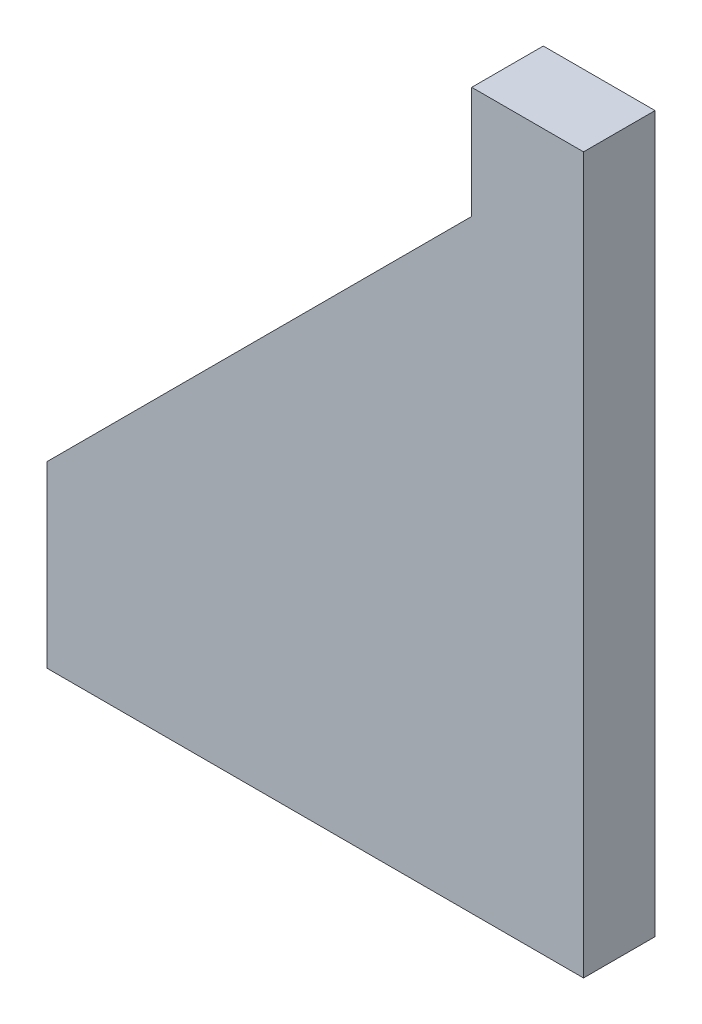
ISO-10303-21;
HEADER;
FILE_DESCRIPTION(('STEP AP214'),'2;1');
FILE_NAME('part.step','',(''),(''),'','','');
FILE_SCHEMA(('AUTOMOTIVE_DESIGN { 1 0 10303 214 1 1 1 1 }'));
ENDSEC;
DATA;
#1=APPLICATION_CONTEXT('core data for automotive mechanical design processes');
#2=APPLICATION_PROTOCOL_DEFINITION('international standard','automotive_design',2000,#1);
#3=PRODUCT_CONTEXT('',#1,'mechanical');
#4=PRODUCT('Part','Part','',(#3));
#5=PRODUCT_RELATED_PRODUCT_CATEGORY('part','',(#4));
#6=PRODUCT_DEFINITION_FORMATION('','',#4);
#7=PRODUCT_DEFINITION_CONTEXT('part definition',#1,'design');
#8=PRODUCT_DEFINITION('design','',#6,#7);
#9=PRODUCT_DEFINITION_SHAPE('','',#8);
#10=(LENGTH_UNIT() NAMED_UNIT(*) SI_UNIT(.MILLI.,.METRE.));
#11=(NAMED_UNIT(*) PLANE_ANGLE_UNIT() SI_UNIT($,.RADIAN.));
#12=(NAMED_UNIT(*) SI_UNIT($,.STERADIAN.) SOLID_ANGLE_UNIT());
#13=UNCERTAINTY_MEASURE_WITH_UNIT(LENGTH_MEASURE(1.E-05),#10,'distance_accuracy_value','');
#14=(GEOMETRIC_REPRESENTATION_CONTEXT(3) GLOBAL_UNCERTAINTY_ASSIGNED_CONTEXT((#13)) GLOBAL_UNIT_ASSIGNED_CONTEXT((#10,
#11,#12)) REPRESENTATION_CONTEXT('',''));
#15=CARTESIAN_POINT('',(0.,0.,0.));
#16=DIRECTION('',(0.,0.,1.));
#17=DIRECTION('',(1.,0.,0.));
#18=AXIS2_PLACEMENT_3D('',#15,#16,#17);
#19=CARTESIAN_POINT('',(-15.628610956945,-412.480747772816,40.));
#20=DIRECTION('',(-1.,0.,0.));
#21=DIRECTION('',(0.,0.,1.));
#22=AXIS2_PLACEMENT_3D('',#19,#20,#21);
#23=PLANE('',#22);
#24=DIRECTION('',(0.,1.,0.));
#25=VECTOR('',#24,1.);
#26=CARTESIAN_POINT('',(-15.628610956945,-412.480747772816,0.));
#27=LINE('',#26,#25);
#28=CARTESIAN_POINT('',(-15.628610956945,282.34173693086,0.));
#29=VERTEX_POINT('',#28);
#30=CARTESIAN_POINT('',(-15.628610956945,344.84173693086,0.));
#31=VERTEX_POINT('',#30);
#32=EDGE_CURVE('E112',#29,#31,#27,.T.);
#33=ORIENTED_EDGE('',*,*,#32,.F.);
#34=DIRECTION('',(0.,0.,-1.));
#35=VECTOR('',#34,1.);
#36=CARTESIAN_POINT('',(-15.628610956945,282.34173693086,40.));
#37=LINE('',#36,#35);
#38=CARTESIAN_POINT('',(-15.628610956945,282.34173693086,40.));
#39=VERTEX_POINT('',#38);
#40=EDGE_CURVE('E11',#39,#29,#37,.T.);
#41=ORIENTED_EDGE('',*,*,#40,.F.);
#42=DIRECTION('',(0.,1.,0.));
#43=VECTOR('',#42,1.);
#44=CARTESIAN_POINT('',(-15.628610956945,-412.480747772816,40.));
#45=LINE('',#44,#43);
#46=CARTESIAN_POINT('',(-15.628610956945,344.84173693086,40.));
#47=VERTEX_POINT('',#46);
#48=EDGE_CURVE('E125',#39,#47,#45,.T.);
#49=ORIENTED_EDGE('',*,*,#48,.T.);
#50=DIRECTION('',(0.,0.,-1.));
#51=VECTOR('',#50,1.);
#52=CARTESIAN_POINT('',(-15.628610956945,344.84173693086,40.));
#53=LINE('',#52,#51);
#54=EDGE_CURVE('E77',#47,#31,#53,.T.);
#55=ORIENTED_EDGE('',*,*,#54,.T.);
#56=EDGE_LOOP('',(#33,#41,#49,#55));
#57=FACE_BOUND('',#56,.T.);
#58=ADVANCED_FACE('F32',(#57),#23,.T.);
#59=CARTESIAN_POINT('',(-364.363959311361,-66.3936114235557,40.));
#60=DIRECTION('',(-0.707106781186548,0.707106781186547,0.));
#61=DIRECTION('',(-0.707106781186547,-0.707106781186548,0.));
#62=AXIS2_PLACEMENT_3D('',#59,#60,#61);
#63=PLANE('',#62);
#64=DIRECTION('',(0.707106781186547,0.707106781186548,0.));
#65=VECTOR('',#64,1.);
#66=CARTESIAN_POINT('',(-364.363959311361,-66.3936114235557,0.));
#67=LINE('',#66,#65);
#68=CARTESIAN_POINT('',(-253.128610956945,44.8417369308601,0.));
#69=VERTEX_POINT('',#68);
#70=EDGE_CURVE('E115',#69,#29,#67,.T.);
#71=ORIENTED_EDGE('',*,*,#70,.F.);
#72=DIRECTION('',(0.,0.,-1.));
#73=VECTOR('',#72,1.);
#74=CARTESIAN_POINT('',(-253.128610956945,44.8417369308601,40.));
#75=LINE('',#74,#73);
#76=CARTESIAN_POINT('',(-253.128610956945,44.8417369308601,40.));
#77=VERTEX_POINT('',#76);
#78=EDGE_CURVE('E40',#77,#69,#75,.T.);
#79=ORIENTED_EDGE('',*,*,#78,.F.);
#80=DIRECTION('',(0.707106781186547,0.707106781186548,0.));
#81=VECTOR('',#80,1.);
#82=CARTESIAN_POINT('',(-364.363959311361,-66.3936114235557,40.));
#83=LINE('',#82,#81);
#84=EDGE_CURVE('E140',#77,#39,#83,.T.);
#85=ORIENTED_EDGE('',*,*,#84,.T.);
#86=ORIENTED_EDGE('',*,*,#40,.T.);
#87=EDGE_LOOP('',(#71,#79,#85,#86));
#88=FACE_BOUND('',#87,.T.);
#89=ADVANCED_FACE('F134',(#88),#63,.T.);
#90=CARTESIAN_POINT('',(-253.128610956945,-412.480747772816,40.));
#91=DIRECTION('',(-1.,0.,0.));
#92=DIRECTION('',(0.,0.,1.));
#93=AXIS2_PLACEMENT_3D('',#90,#91,#92);
#94=PLANE('',#93);
#95=DIRECTION('',(0.,1.,0.));
#96=VECTOR('',#95,1.);
#97=CARTESIAN_POINT('',(-253.128610956945,-412.480747772816,0.));
#98=LINE('',#97,#96);
#99=CARTESIAN_POINT('',(-253.128610956945,-55.15826306914,0.));
#100=VERTEX_POINT('',#99);
#101=EDGE_CURVE('E118',#100,#69,#98,.T.);
#102=ORIENTED_EDGE('',*,*,#101,.F.);
#103=DIRECTION('',(0.,0.,-1.));
#104=VECTOR('',#103,1.);
#105=CARTESIAN_POINT('',(-253.128610956945,-55.15826306914,40.));
#106=LINE('',#105,#104);
#107=CARTESIAN_POINT('',(-253.128610956945,-55.15826306914,40.));
#108=VERTEX_POINT('',#107);
#109=EDGE_CURVE('E104',#108,#100,#106,.T.);
#110=ORIENTED_EDGE('',*,*,#109,.F.);
#111=DIRECTION('',(0.,1.,0.));
#112=VECTOR('',#111,1.);
#113=CARTESIAN_POINT('',(-253.128610956945,-412.480747772816,40.));
#114=LINE('',#113,#112);
#115=EDGE_CURVE('E97',#108,#77,#114,.T.);
#116=ORIENTED_EDGE('',*,*,#115,.T.);
#117=ORIENTED_EDGE('',*,*,#78,.T.);
#118=EDGE_LOOP('',(#102,#110,#116,#117));
#119=FACE_BOUND('',#118,.T.);
#120=ADVANCED_FACE('F131',(#119),#94,.T.);
#121=CARTESIAN_POINT('',(-18.2768229620998,-55.15826306914,40.));
#122=DIRECTION('',(0.,1.,0.));
#123=DIRECTION('',(0.,0.,1.));
#124=AXIS2_PLACEMENT_3D('',#121,#122,#123);
#125=PLANE('',#124);
#126=DIRECTION('',(1.,0.,0.));
#127=VECTOR('',#126,1.);
#128=CARTESIAN_POINT('',(-18.2768229620998,-55.15826306914,0.));
#129=LINE('',#128,#127);
#130=CARTESIAN_POINT('',(46.8713890430551,-55.15826306914,0.));
#131=VERTEX_POINT('',#130);
#132=EDGE_CURVE('E103',#100,#131,#129,.T.);
#133=ORIENTED_EDGE('',*,*,#132,.T.);
#134=DIRECTION('',(0.,0.,-1.));
#135=VECTOR('',#134,1.);
#136=CARTESIAN_POINT('',(46.8713890430551,-55.15826306914,40.));
#137=LINE('',#136,#135);
#138=CARTESIAN_POINT('',(46.8713890430551,-55.15826306914,40.));
#139=VERTEX_POINT('',#138);
#140=EDGE_CURVE('E100',#139,#131,#137,.T.);
#141=ORIENTED_EDGE('',*,*,#140,.F.);
#142=DIRECTION('',(1.,0.,0.));
#143=VECTOR('',#142,1.);
#144=CARTESIAN_POINT('',(-18.2768229620998,-55.15826306914,40.));
#145=LINE('',#144,#143);
#146=EDGE_CURVE('E90',#108,#139,#145,.T.);
#147=ORIENTED_EDGE('',*,*,#146,.F.);
#148=ORIENTED_EDGE('',*,*,#109,.T.);
#149=EDGE_LOOP('',(#133,#141,#147,#148));
#150=FACE_BOUND('',#149,.T.);
#151=ADVANCED_FACE('F101',(#150),#125,.F.);
#152=CARTESIAN_POINT('',(46.8713890430551,-412.480747772816,40.));
#153=DIRECTION('',(-1.,0.,0.));
#154=DIRECTION('',(0.,0.,1.));
#155=AXIS2_PLACEMENT_3D('',#152,#153,#154);
#156=PLANE('',#155);
#157=DIRECTION('',(0.,1.,0.));
#158=VECTOR('',#157,1.);
#159=CARTESIAN_POINT('',(46.8713890430551,-412.480747772816,0.));
#160=LINE('',#159,#158);
#161=CARTESIAN_POINT('',(46.8713890430551,344.84173693086,0.));
#162=VERTEX_POINT('',#161);
#163=EDGE_CURVE('E70',#131,#162,#160,.T.);
#164=ORIENTED_EDGE('',*,*,#163,.T.);
#165=DIRECTION('',(0.,0.,-1.));
#166=VECTOR('',#165,1.);
#167=CARTESIAN_POINT('',(46.8713890430551,344.84173693086,40.));
#168=LINE('',#167,#166);
#169=CARTESIAN_POINT('',(46.8713890430551,344.84173693086,40.));
#170=VERTEX_POINT('',#169);
#171=EDGE_CURVE('E105',#170,#162,#168,.T.);
#172=ORIENTED_EDGE('',*,*,#171,.F.);
#173=DIRECTION('',(0.,1.,0.));
#174=VECTOR('',#173,1.);
#175=CARTESIAN_POINT('',(46.8713890430551,-412.480747772816,40.));
#176=LINE('',#175,#174);
#177=EDGE_CURVE('E94',#139,#170,#176,.T.);
#178=ORIENTED_EDGE('',*,*,#177,.F.);
#179=ORIENTED_EDGE('',*,*,#140,.T.);
#180=EDGE_LOOP('',(#164,#172,#178,#179));
#181=FACE_BOUND('',#180,.T.);
#182=ADVANCED_FACE('F107',(#181),#156,.F.);
#183=CARTESIAN_POINT('',(-18.2768229620998,344.84173693086,40.));
#184=DIRECTION('',(0.,-1.,0.));
#185=DIRECTION('',(0.,0.,-1.));
#186=AXIS2_PLACEMENT_3D('',#183,#184,#185);
#187=PLANE('',#186);
#188=DIRECTION('',(-1.,0.,0.));
#189=VECTOR('',#188,1.);
#190=CARTESIAN_POINT('',(-18.2768229620998,344.84173693086,0.));
#191=LINE('',#190,#189);
#192=EDGE_CURVE('E123',#162,#31,#191,.T.);
#193=ORIENTED_EDGE('',*,*,#192,.T.);
#194=ORIENTED_EDGE('',*,*,#54,.F.);
#195=DIRECTION('',(-1.,0.,0.));
#196=VECTOR('',#195,1.);
#197=CARTESIAN_POINT('',(-18.2768229620998,344.84173693086,40.));
#198=LINE('',#197,#196);
#199=EDGE_CURVE('E48',#170,#47,#198,.T.);
#200=ORIENTED_EDGE('',*,*,#199,.F.);
#201=ORIENTED_EDGE('',*,*,#171,.T.);
#202=EDGE_LOOP('',(#193,#194,#200,#201));
#203=FACE_BOUND('',#202,.T.);
#204=ADVANCED_FACE('F139',(#203),#187,.F.);
#205=CARTESIAN_POINT('',(-18.2768229620998,-412.480747772816,40.));
#206=DIRECTION('',(0.,0.,1.));
#207=DIRECTION('',(1.,0.,0.));
#208=AXIS2_PLACEMENT_3D('',#205,#206,#207);
#209=PLANE('',#208);
#210=ORIENTED_EDGE('',*,*,#48,.F.);
#211=ORIENTED_EDGE('',*,*,#84,.F.);
#212=ORIENTED_EDGE('',*,*,#115,.F.);
#213=ORIENTED_EDGE('',*,*,#146,.T.);
#214=ORIENTED_EDGE('',*,*,#177,.T.);
#215=ORIENTED_EDGE('',*,*,#199,.T.);
#216=EDGE_LOOP('',(#210,#211,#212,#213,#214,#215));
#217=FACE_BOUND('',#216,.T.);
#218=ADVANCED_FACE('F92',(#217),#209,.T.);
#219=CARTESIAN_POINT('',(-18.2768229620998,-412.480747772816,0.));
#220=DIRECTION('',(0.,0.,1.));
#221=DIRECTION('',(1.,0.,0.));
#222=AXIS2_PLACEMENT_3D('',#219,#220,#221);
#223=PLANE('',#222);
#224=ORIENTED_EDGE('',*,*,#32,.T.);
#225=ORIENTED_EDGE('',*,*,#192,.F.);
#226=ORIENTED_EDGE('',*,*,#163,.F.);
#227=ORIENTED_EDGE('',*,*,#132,.F.);
#228=ORIENTED_EDGE('',*,*,#101,.T.);
#229=ORIENTED_EDGE('',*,*,#70,.T.);
#230=EDGE_LOOP('',(#224,#225,#226,#227,#228,#229));
#231=FACE_BOUND('',#230,.T.);
#232=ADVANCED_FACE('F136',(#231),#223,.F.);
#233=CLOSED_SHELL('',(#58,#89,#120,#151,#182,#204,#218,#232));
#234=MANIFOLD_SOLID_BREP('B2',#233);
#235=ADVANCED_BREP_SHAPE_REPRESENTATION('',(#18,#234),#14);
#236=SHAPE_DEFINITION_REPRESENTATION(#9,#235);
ENDSEC;
END-ISO-10303-21;
